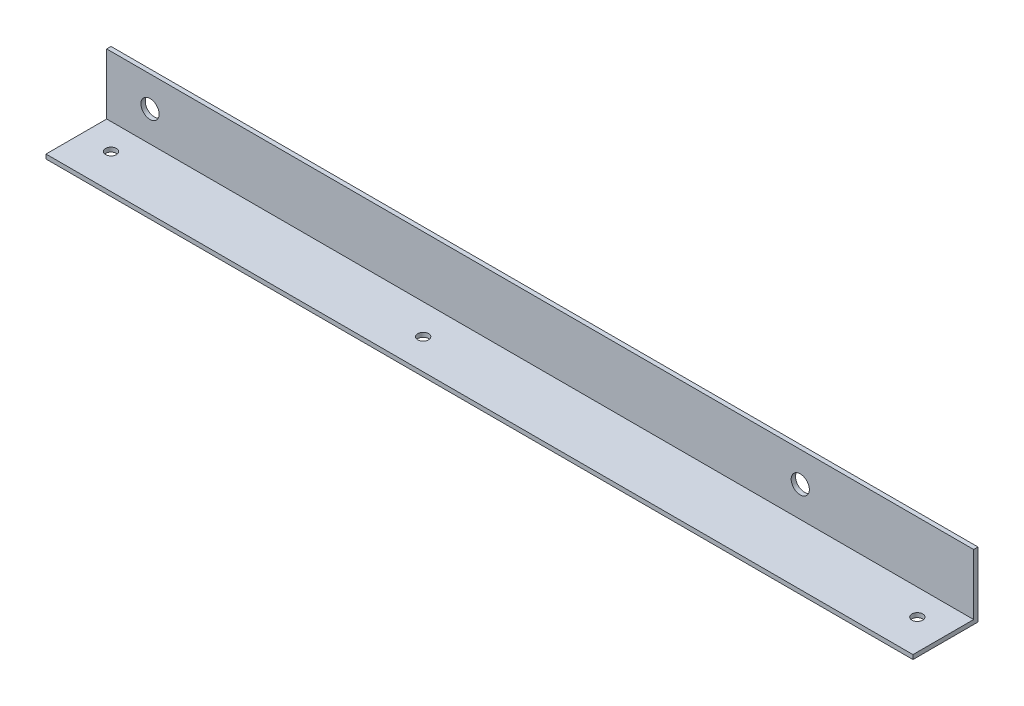
ISO-10303-21;
HEADER;
FILE_DESCRIPTION(('STEP AP214'),'2;1');
FILE_NAME('part.step','',(''),(''),'','','');
FILE_SCHEMA(('AUTOMOTIVE_DESIGN { 1 0 10303 214 1 1 1 1 }'));
ENDSEC;
DATA;
#1=APPLICATION_CONTEXT('core data for automotive mechanical design processes');
#2=APPLICATION_PROTOCOL_DEFINITION('international standard','automotive_design',2000,#1);
#3=PRODUCT_CONTEXT('',#1,'mechanical');
#4=PRODUCT('Part','Part','',(#3));
#5=PRODUCT_RELATED_PRODUCT_CATEGORY('part','',(#4));
#6=PRODUCT_DEFINITION_FORMATION('','',#4);
#7=PRODUCT_DEFINITION_CONTEXT('part definition',#1,'design');
#8=PRODUCT_DEFINITION('design','',#6,#7);
#9=PRODUCT_DEFINITION_SHAPE('','',#8);
#10=(LENGTH_UNIT() NAMED_UNIT(*) SI_UNIT(.MILLI.,.METRE.));
#11=(NAMED_UNIT(*) PLANE_ANGLE_UNIT() SI_UNIT($,.RADIAN.));
#12=(NAMED_UNIT(*) SI_UNIT($,.STERADIAN.) SOLID_ANGLE_UNIT());
#13=UNCERTAINTY_MEASURE_WITH_UNIT(LENGTH_MEASURE(1.E-05),#10,'distance_accuracy_value','');
#14=(GEOMETRIC_REPRESENTATION_CONTEXT(3) GLOBAL_UNCERTAINTY_ASSIGNED_CONTEXT((#13)) GLOBAL_UNIT_ASSIGNED_CONTEXT((#10,
#11,#12)) REPRESENTATION_CONTEXT('',''));
#15=CARTESIAN_POINT('',(0.,0.,0.));
#16=DIRECTION('',(0.,0.,1.));
#17=DIRECTION('',(1.,0.,0.));
#18=AXIS2_PLACEMENT_3D('',#15,#16,#17);
#19=CARTESIAN_POINT('',(0.,0.,1.));
#20=DIRECTION('',(0.,0.,-1.));
#21=DIRECTION('',(-1.,0.,0.));
#22=AXIS2_PLACEMENT_3D('',#19,#20,#21);
#23=PLANE('',#22);
#24=CARTESIAN_POINT('',(10.,8.,1.));
#25=DIRECTION('',(0.,0.,-1.));
#26=DIRECTION('',(-1.,0.,0.));
#27=AXIS2_PLACEMENT_3D('',#24,#25,#26);
#28=CIRCLE('',#27,2.1);
#29=CARTESIAN_POINT('',(7.9,8.,1.));
#30=VERTEX_POINT('',#29);
#31=EDGE_CURVE('E200',#30,#30,#28,.T.);
#32=ORIENTED_EDGE('',*,*,#31,.T.);
#33=EDGE_LOOP('',(#32));
#34=FACE_BOUND('',#33,.T.);
#35=CARTESIAN_POINT('',(160.,8.,1.));
#36=DIRECTION('',(0.,0.,-1.));
#37=DIRECTION('',(-1.,0.,0.));
#38=AXIS2_PLACEMENT_3D('',#35,#36,#37);
#39=CIRCLE('',#38,2.09999999999999);
#40=CARTESIAN_POINT('',(157.9,8.,1.));
#41=VERTEX_POINT('',#40);
#42=EDGE_CURVE('E137',#41,#41,#39,.T.);
#43=ORIENTED_EDGE('',*,*,#42,.T.);
#44=EDGE_LOOP('',(#43));
#45=FACE_BOUND('',#44,.T.);
#46=DIRECTION('',(-1.,0.,0.));
#47=VECTOR('',#46,1.);
#48=CARTESIAN_POINT('',(0.,1.,1.));
#49=LINE('',#48,#47);
#50=CARTESIAN_POINT('',(200.,1.,1.));
#51=VERTEX_POINT('',#50);
#52=CARTESIAN_POINT('',(0.,1.,1.));
#53=VERTEX_POINT('',#52);
#54=EDGE_CURVE('E50',#51,#53,#49,.T.);
#55=ORIENTED_EDGE('',*,*,#54,.F.);
#56=DIRECTION('',(0.,1.,0.));
#57=VECTOR('',#56,1.);
#58=CARTESIAN_POINT('',(200.,0.,1.));
#59=LINE('',#58,#57);
#60=CARTESIAN_POINT('',(200.,15.,1.));
#61=VERTEX_POINT('',#60);
#62=EDGE_CURVE('E139',#51,#61,#59,.T.);
#63=ORIENTED_EDGE('',*,*,#62,.T.);
#64=DIRECTION('',(-1.,0.,0.));
#65=VECTOR('',#64,1.);
#66=CARTESIAN_POINT('',(0.,15.,1.));
#67=LINE('',#66,#65);
#68=CARTESIAN_POINT('',(0.,15.,1.));
#69=VERTEX_POINT('',#68);
#70=EDGE_CURVE('E56',#61,#69,#67,.T.);
#71=ORIENTED_EDGE('',*,*,#70,.T.);
#72=DIRECTION('',(0.,-1.,0.));
#73=VECTOR('',#72,1.);
#74=CARTESIAN_POINT('',(0.,0.,1.));
#75=LINE('',#74,#73);
#76=EDGE_CURVE('E85',#69,#53,#75,.T.);
#77=ORIENTED_EDGE('',*,*,#76,.T.);
#78=EDGE_LOOP('',(#55,#63,#71,#77));
#79=FACE_BOUND('',#78,.T.);
#80=ADVANCED_FACE('F35',(#34,#45,#79),#23,.F.);
#81=CARTESIAN_POINT('',(0.,0.,1.));
#82=DIRECTION('',(1.,0.,0.));
#83=DIRECTION('',(0.,0.,-1.));
#84=AXIS2_PLACEMENT_3D('',#81,#82,#83);
#85=PLANE('',#84);
#86=DIRECTION('',(0.,-1.,0.));
#87=VECTOR('',#86,1.);
#88=CARTESIAN_POINT('',(0.,0.,0.));
#89=LINE('',#88,#87);
#90=CARTESIAN_POINT('',(0.,15.,0.));
#91=VERTEX_POINT('',#90);
#92=CARTESIAN_POINT('',(0.,0.,0.));
#93=VERTEX_POINT('',#92);
#94=EDGE_CURVE('E91',#91,#93,#89,.T.);
#95=ORIENTED_EDGE('',*,*,#94,.T.);
#96=DIRECTION('',(0.,0.,-1.));
#97=VECTOR('',#96,1.);
#98=CARTESIAN_POINT('',(0.,0.,1.));
#99=LINE('',#98,#97);
#100=CARTESIAN_POINT('',(0.,0.,15.));
#101=VERTEX_POINT('',#100);
#102=EDGE_CURVE('E11',#101,#93,#99,.T.);
#103=ORIENTED_EDGE('',*,*,#102,.F.);
#104=DIRECTION('',(0.,-1.,0.));
#105=VECTOR('',#104,1.);
#106=CARTESIAN_POINT('',(0.,0.,15.));
#107=LINE('',#106,#105);
#108=CARTESIAN_POINT('',(0.,1.,15.));
#109=VERTEX_POINT('',#108);
#110=EDGE_CURVE('E128',#109,#101,#107,.T.);
#111=ORIENTED_EDGE('',*,*,#110,.F.);
#112=DIRECTION('',(0.,0.,-1.));
#113=VECTOR('',#112,1.);
#114=CARTESIAN_POINT('',(0.,1.,15.));
#115=LINE('',#114,#113);
#116=EDGE_CURVE('E100',#109,#53,#115,.T.);
#117=ORIENTED_EDGE('',*,*,#116,.T.);
#118=ORIENTED_EDGE('',*,*,#76,.F.);
#119=DIRECTION('',(0.,0.,-1.));
#120=VECTOR('',#119,1.);
#121=CARTESIAN_POINT('',(0.,15.,1.));
#122=LINE('',#121,#120);
#123=EDGE_CURVE('E78',#69,#91,#122,.T.);
#124=ORIENTED_EDGE('',*,*,#123,.T.);
#125=EDGE_LOOP('',(#95,#103,#111,#117,#118,#124));
#126=FACE_BOUND('',#125,.T.);
#127=ADVANCED_FACE('F37',(#126),#85,.F.);
#128=CARTESIAN_POINT('',(0.,0.,1.));
#129=DIRECTION('',(0.,1.,0.));
#130=DIRECTION('',(0.,0.,1.));
#131=AXIS2_PLACEMENT_3D('',#128,#129,#130);
#132=PLANE('',#131);
#133=CARTESIAN_POINT('',(7.00000000000001,0.,7.));
#134=DIRECTION('',(0.,-1.,0.));
#135=DIRECTION('',(0.,0.,-1.));
#136=AXIS2_PLACEMENT_3D('',#133,#134,#135);
#137=CIRCLE('',#136,1.24999999999999);
#138=CARTESIAN_POINT('',(7.00000000000001,0.,5.75000000000001));
#139=VERTEX_POINT('',#138);
#140=EDGE_CURVE('E180',#139,#139,#137,.T.);
#141=ORIENTED_EDGE('',*,*,#140,.F.);
#142=EDGE_LOOP('',(#141));
#143=FACE_BOUND('',#142,.T.);
#144=CARTESIAN_POINT('',(80.,0.,8.));
#145=DIRECTION('',(0.,1.,0.));
#146=DIRECTION('',(0.,0.,1.));
#147=AXIS2_PLACEMENT_3D('',#144,#145,#146);
#148=CIRCLE('',#147,1.24999999999999);
#149=CARTESIAN_POINT('',(80.,0.,9.24999999999999));
#150=VERTEX_POINT('',#149);
#151=EDGE_CURVE('E184',#150,#150,#148,.T.);
#152=ORIENTED_EDGE('',*,*,#151,.T.);
#153=EDGE_LOOP('',(#152));
#154=FACE_BOUND('',#153,.T.);
#155=CARTESIAN_POINT('',(193.,0.,7.));
#156=DIRECTION('',(0.,-1.,0.));
#157=DIRECTION('',(0.,0.,-1.));
#158=AXIS2_PLACEMENT_3D('',#155,#156,#157);
#159=CIRCLE('',#158,1.24999999999997);
#160=CARTESIAN_POINT('',(193.,0.,5.75000000000003));
#161=VERTEX_POINT('',#160);
#162=EDGE_CURVE('E187',#161,#161,#159,.T.);
#163=ORIENTED_EDGE('',*,*,#162,.F.);
#164=EDGE_LOOP('',(#163));
#165=FACE_BOUND('',#164,.T.);
#166=DIRECTION('',(1.,0.,0.));
#167=VECTOR('',#166,1.);
#168=CARTESIAN_POINT('',(0.,0.,0.));
#169=LINE('',#168,#167);
#170=CARTESIAN_POINT('',(200.,0.,0.));
#171=VERTEX_POINT('',#170);
#172=EDGE_CURVE('E95',#93,#171,#169,.T.);
#173=ORIENTED_EDGE('',*,*,#172,.T.);
#174=DIRECTION('',(0.,0.,-1.));
#175=VECTOR('',#174,1.);
#176=CARTESIAN_POINT('',(200.,0.,1.));
#177=LINE('',#176,#175);
#178=CARTESIAN_POINT('',(200.,0.,15.));
#179=VERTEX_POINT('',#178);
#180=EDGE_CURVE('E43',#179,#171,#177,.T.);
#181=ORIENTED_EDGE('',*,*,#180,.F.);
#182=DIRECTION('',(1.,0.,0.));
#183=VECTOR('',#182,1.);
#184=CARTESIAN_POINT('',(0.,0.,15.));
#185=LINE('',#184,#183);
#186=EDGE_CURVE('E120',#101,#179,#185,.T.);
#187=ORIENTED_EDGE('',*,*,#186,.F.);
#188=ORIENTED_EDGE('',*,*,#102,.T.);
#189=EDGE_LOOP('',(#173,#181,#187,#188));
#190=FACE_BOUND('',#189,.T.);
#191=ADVANCED_FACE('F118',(#143,#154,#165,#190),#132,.F.);
#192=CARTESIAN_POINT('',(200.,0.,1.));
#193=DIRECTION('',(-1.,0.,0.));
#194=DIRECTION('',(0.,0.,1.));
#195=AXIS2_PLACEMENT_3D('',#192,#193,#194);
#196=PLANE('',#195);
#197=DIRECTION('',(0.,1.,0.));
#198=VECTOR('',#197,1.);
#199=CARTESIAN_POINT('',(200.,0.,0.));
#200=LINE('',#199,#198);
#201=CARTESIAN_POINT('',(200.,15.,0.));
#202=VERTEX_POINT('',#201);
#203=EDGE_CURVE('E86',#171,#202,#200,.T.);
#204=ORIENTED_EDGE('',*,*,#203,.T.);
#205=DIRECTION('',(0.,0.,-1.));
#206=VECTOR('',#205,1.);
#207=CARTESIAN_POINT('',(200.,15.,1.));
#208=LINE('',#207,#206);
#209=EDGE_CURVE('E81',#61,#202,#208,.T.);
#210=ORIENTED_EDGE('',*,*,#209,.F.);
#211=ORIENTED_EDGE('',*,*,#62,.F.);
#212=DIRECTION('',(0.,0.,-1.));
#213=VECTOR('',#212,1.);
#214=CARTESIAN_POINT('',(200.,1.,15.));
#215=LINE('',#214,#213);
#216=CARTESIAN_POINT('',(200.,1.,15.));
#217=VERTEX_POINT('',#216);
#218=EDGE_CURVE('E96',#217,#51,#215,.T.);
#219=ORIENTED_EDGE('',*,*,#218,.F.);
#220=DIRECTION('',(0.,1.,0.));
#221=VECTOR('',#220,1.);
#222=CARTESIAN_POINT('',(200.,0.,15.));
#223=LINE('',#222,#221);
#224=EDGE_CURVE('E114',#179,#217,#223,.T.);
#225=ORIENTED_EDGE('',*,*,#224,.F.);
#226=ORIENTED_EDGE('',*,*,#180,.T.);
#227=EDGE_LOOP('',(#204,#210,#211,#219,#225,#226));
#228=FACE_BOUND('',#227,.T.);
#229=ADVANCED_FACE('F110',(#228),#196,.F.);
#230=CARTESIAN_POINT('',(0.,15.,1.));
#231=DIRECTION('',(0.,-1.,0.));
#232=DIRECTION('',(0.,0.,-1.));
#233=AXIS2_PLACEMENT_3D('',#230,#231,#232);
#234=PLANE('',#233);
#235=DIRECTION('',(-1.,0.,0.));
#236=VECTOR('',#235,1.);
#237=CARTESIAN_POINT('',(0.,15.,0.));
#238=LINE('',#237,#236);
#239=EDGE_CURVE('E75',#202,#91,#238,.T.);
#240=ORIENTED_EDGE('',*,*,#239,.T.);
#241=ORIENTED_EDGE('',*,*,#123,.F.);
#242=ORIENTED_EDGE('',*,*,#70,.F.);
#243=ORIENTED_EDGE('',*,*,#209,.T.);
#244=EDGE_LOOP('',(#240,#241,#242,#243));
#245=FACE_BOUND('',#244,.T.);
#246=ADVANCED_FACE('F77',(#245),#234,.F.);
#247=CARTESIAN_POINT('',(0.,0.,0.));
#248=DIRECTION('',(0.,0.,-1.));
#249=DIRECTION('',(-1.,0.,0.));
#250=AXIS2_PLACEMENT_3D('',#247,#248,#249);
#251=PLANE('',#250);
#252=CARTESIAN_POINT('',(10.,8.,0.));
#253=DIRECTION('',(0.,0.,-1.));
#254=DIRECTION('',(-1.,0.,0.));
#255=AXIS2_PLACEMENT_3D('',#252,#253,#254);
#256=CIRCLE('',#255,2.1);
#257=CARTESIAN_POINT('',(7.9,8.,0.));
#258=VERTEX_POINT('',#257);
#259=EDGE_CURVE('E192',#258,#258,#256,.T.);
#260=ORIENTED_EDGE('',*,*,#259,.F.);
#261=EDGE_LOOP('',(#260));
#262=FACE_BOUND('',#261,.T.);
#263=CARTESIAN_POINT('',(160.,8.,0.));
#264=DIRECTION('',(0.,0.,-1.));
#265=DIRECTION('',(-1.,0.,0.));
#266=AXIS2_PLACEMENT_3D('',#263,#264,#265);
#267=CIRCLE('',#266,2.09999999999999);
#268=CARTESIAN_POINT('',(157.9,8.,0.));
#269=VERTEX_POINT('',#268);
#270=EDGE_CURVE('E202',#269,#269,#267,.T.);
#271=ORIENTED_EDGE('',*,*,#270,.F.);
#272=EDGE_LOOP('',(#271));
#273=FACE_BOUND('',#272,.T.);
#274=ORIENTED_EDGE('',*,*,#94,.F.);
#275=ORIENTED_EDGE('',*,*,#239,.F.);
#276=ORIENTED_EDGE('',*,*,#203,.F.);
#277=ORIENTED_EDGE('',*,*,#172,.F.);
#278=EDGE_LOOP('',(#274,#275,#276,#277));
#279=FACE_BOUND('',#278,.T.);
#280=ADVANCED_FACE('F94',(#262,#273,#279),#251,.T.);
#281=CARTESIAN_POINT('',(0.,1.,15.));
#282=DIRECTION('',(0.,-1.,0.));
#283=DIRECTION('',(0.,0.,-1.));
#284=AXIS2_PLACEMENT_3D('',#281,#282,#283);
#285=PLANE('',#284);
#286=CARTESIAN_POINT('',(7.00000000000001,1.,7.));
#287=DIRECTION('',(0.,-1.,0.));
#288=DIRECTION('',(0.,0.,-1.));
#289=AXIS2_PLACEMENT_3D('',#286,#287,#288);
#290=CIRCLE('',#289,1.24999999999999);
#291=CARTESIAN_POINT('',(7.00000000000001,1.,5.75000000000001));
#292=VERTEX_POINT('',#291);
#293=EDGE_CURVE('E231',#292,#292,#290,.T.);
#294=ORIENTED_EDGE('',*,*,#293,.T.);
#295=EDGE_LOOP('',(#294));
#296=FACE_BOUND('',#295,.T.);
#297=CARTESIAN_POINT('',(80.,1.,8.));
#298=DIRECTION('',(0.,1.,0.));
#299=DIRECTION('',(0.,0.,1.));
#300=AXIS2_PLACEMENT_3D('',#297,#298,#299);
#301=CIRCLE('',#300,1.24999999999999);
#302=CARTESIAN_POINT('',(80.,1.,9.24999999999999));
#303=VERTEX_POINT('',#302);
#304=EDGE_CURVE('E194',#303,#303,#301,.T.);
#305=ORIENTED_EDGE('',*,*,#304,.F.);
#306=EDGE_LOOP('',(#305));
#307=FACE_BOUND('',#306,.T.);
#308=CARTESIAN_POINT('',(193.,1.,7.));
#309=DIRECTION('',(0.,-1.,0.));
#310=DIRECTION('',(0.,0.,-1.));
#311=AXIS2_PLACEMENT_3D('',#308,#309,#310);
#312=CIRCLE('',#311,1.24999999999999);
#313=CARTESIAN_POINT('',(193.,1.,5.75000000000001));
#314=VERTEX_POINT('',#313);
#315=EDGE_CURVE('E189',#314,#314,#312,.T.);
#316=ORIENTED_EDGE('',*,*,#315,.T.);
#317=EDGE_LOOP('',(#316));
#318=FACE_BOUND('',#317,.T.);
#319=ORIENTED_EDGE('',*,*,#54,.T.);
#320=ORIENTED_EDGE('',*,*,#116,.F.);
#321=DIRECTION('',(-1.,0.,0.));
#322=VECTOR('',#321,1.);
#323=CARTESIAN_POINT('',(0.,1.,15.));
#324=LINE('',#323,#322);
#325=EDGE_CURVE('E130',#217,#109,#324,.T.);
#326=ORIENTED_EDGE('',*,*,#325,.F.);
#327=ORIENTED_EDGE('',*,*,#218,.T.);
#328=EDGE_LOOP('',(#319,#320,#326,#327));
#329=FACE_BOUND('',#328,.T.);
#330=ADVANCED_FACE('F142',(#296,#307,#318,#329),#285,.F.);
#331=CARTESIAN_POINT('',(0.,0.,15.));
#332=DIRECTION('',(0.,0.,-1.));
#333=DIRECTION('',(-1.,0.,0.));
#334=AXIS2_PLACEMENT_3D('',#331,#332,#333);
#335=PLANE('',#334);
#336=ORIENTED_EDGE('',*,*,#110,.T.);
#337=ORIENTED_EDGE('',*,*,#186,.T.);
#338=ORIENTED_EDGE('',*,*,#224,.T.);
#339=ORIENTED_EDGE('',*,*,#325,.T.);
#340=EDGE_LOOP('',(#336,#337,#338,#339));
#341=FACE_BOUND('',#340,.T.);
#342=ADVANCED_FACE('F125',(#341),#335,.F.);
#343=CARTESIAN_POINT('',(160.,8.,0.));
#344=DIRECTION('',(0.,0.,-1.));
#345=DIRECTION('',(-1.,0.,0.));
#346=AXIS2_PLACEMENT_3D('',#343,#344,#345);
#347=CYLINDRICAL_SURFACE('',#346,2.09999999999999);
#348=ORIENTED_EDGE('',*,*,#270,.T.);
#349=EDGE_LOOP('',(#348));
#350=FACE_BOUND('',#349,.T.);
#351=ORIENTED_EDGE('',*,*,#42,.F.);
#352=EDGE_LOOP('',(#351));
#353=FACE_BOUND('',#352,.T.);
#354=ADVANCED_FACE('F155',(#350,#353),#347,.F.);
#355=CARTESIAN_POINT('',(10.,8.,0.));
#356=DIRECTION('',(0.,0.,-1.));
#357=DIRECTION('',(-1.,0.,0.));
#358=AXIS2_PLACEMENT_3D('',#355,#356,#357);
#359=CYLINDRICAL_SURFACE('',#358,2.1);
#360=ORIENTED_EDGE('',*,*,#259,.T.);
#361=EDGE_LOOP('',(#360));
#362=FACE_BOUND('',#361,.T.);
#363=ORIENTED_EDGE('',*,*,#31,.F.);
#364=EDGE_LOOP('',(#363));
#365=FACE_BOUND('',#364,.T.);
#366=ADVANCED_FACE('F208',(#362,#365),#359,.F.);
#367=CARTESIAN_POINT('',(193.,0.,7.));
#368=DIRECTION('',(0.,-1.,0.));
#369=DIRECTION('',(0.,0.,-1.));
#370=AXIS2_PLACEMENT_3D('',#367,#368,#369);
#371=CYLINDRICAL_SURFACE('',#370,1.24999999999999);
#372=ORIENTED_EDGE('',*,*,#162,.T.);
#373=EDGE_LOOP('',(#372));
#374=FACE_BOUND('',#373,.T.);
#375=ORIENTED_EDGE('',*,*,#315,.F.);
#376=EDGE_LOOP('',(#375));
#377=FACE_BOUND('',#376,.T.);
#378=ADVANCED_FACE('F214',(#374,#377),#371,.F.);
#379=CARTESIAN_POINT('',(80.,1.,8.));
#380=DIRECTION('',(0.,1.,0.));
#381=DIRECTION('',(0.,0.,1.));
#382=AXIS2_PLACEMENT_3D('',#379,#380,#381);
#383=CYLINDRICAL_SURFACE('',#382,1.24999999999999);
#384=ORIENTED_EDGE('',*,*,#151,.F.);
#385=EDGE_LOOP('',(#384));
#386=FACE_BOUND('',#385,.T.);
#387=ORIENTED_EDGE('',*,*,#304,.T.);
#388=EDGE_LOOP('',(#387));
#389=FACE_BOUND('',#388,.T.);
#390=ADVANCED_FACE('F220',(#386,#389),#383,.F.);
#391=CARTESIAN_POINT('',(7.00000000000001,0.,7.));
#392=DIRECTION('',(0.,-1.,0.));
#393=DIRECTION('',(0.,0.,-1.));
#394=AXIS2_PLACEMENT_3D('',#391,#392,#393);
#395=CYLINDRICAL_SURFACE('',#394,1.24999999999999);
#396=ORIENTED_EDGE('',*,*,#140,.T.);
#397=EDGE_LOOP('',(#396));
#398=FACE_BOUND('',#397,.T.);
#399=ORIENTED_EDGE('',*,*,#293,.F.);
#400=EDGE_LOOP('',(#399));
#401=FACE_BOUND('',#400,.T.);
#402=ADVANCED_FACE('F223',(#398,#401),#395,.F.);
#403=CLOSED_SHELL('',(#80,#127,#191,#229,#246,#280,#330,#342,#354,#366,#378,#390,#402));
#404=MANIFOLD_SOLID_BREP('B2',#403);
#405=ADVANCED_BREP_SHAPE_REPRESENTATION('',(#18,#404),#14);
#406=SHAPE_DEFINITION_REPRESENTATION(#9,#405);
ENDSEC;
END-ISO-10303-21;
